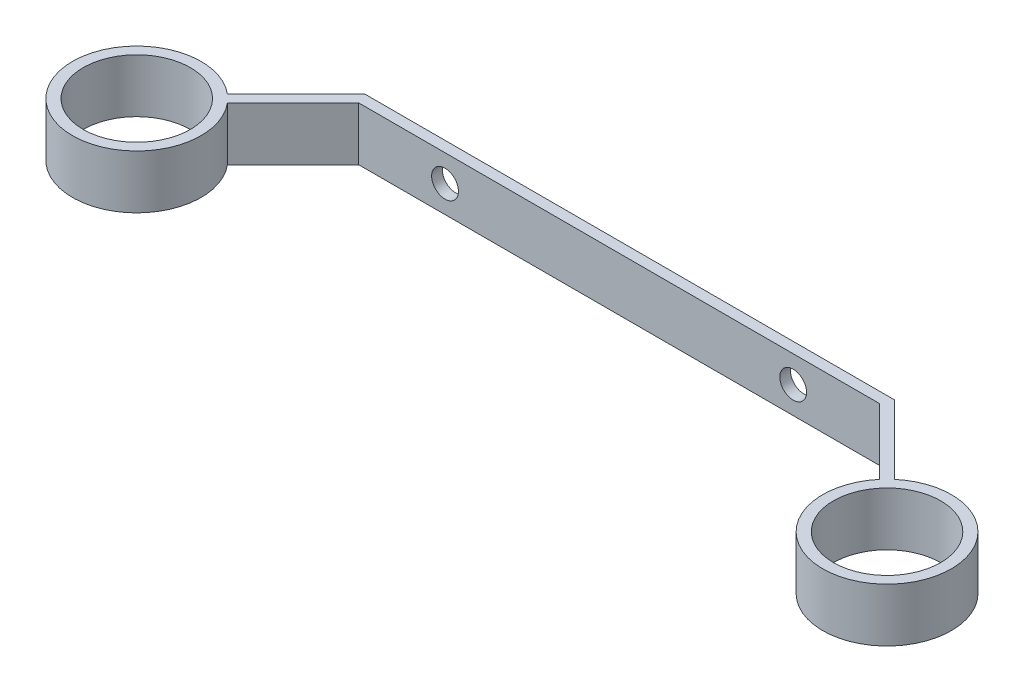
ISO-10303-21;
HEADER;
FILE_DESCRIPTION(('STEP AP214'),'2;1');
FILE_NAME('part.step','',(''),(''),'','','');
FILE_SCHEMA(('AUTOMOTIVE_DESIGN { 1 0 10303 214 1 1 1 1 }'));
ENDSEC;
DATA;
#1=APPLICATION_CONTEXT('core data for automotive mechanical design processes');
#2=APPLICATION_PROTOCOL_DEFINITION('international standard','automotive_design',2000,#1);
#3=PRODUCT_CONTEXT('',#1,'mechanical');
#4=PRODUCT('Part','Part','',(#3));
#5=PRODUCT_RELATED_PRODUCT_CATEGORY('part','',(#4));
#6=PRODUCT_DEFINITION_FORMATION('','',#4);
#7=PRODUCT_DEFINITION_CONTEXT('part definition',#1,'design');
#8=PRODUCT_DEFINITION('design','',#6,#7);
#9=PRODUCT_DEFINITION_SHAPE('','',#8);
#10=(LENGTH_UNIT() NAMED_UNIT(*) SI_UNIT(.MILLI.,.METRE.));
#11=(NAMED_UNIT(*) PLANE_ANGLE_UNIT() SI_UNIT($,.RADIAN.));
#12=(NAMED_UNIT(*) SI_UNIT($,.STERADIAN.) SOLID_ANGLE_UNIT());
#13=UNCERTAINTY_MEASURE_WITH_UNIT(LENGTH_MEASURE(1.E-05),#10,'distance_accuracy_value','');
#14=(GEOMETRIC_REPRESENTATION_CONTEXT(3) GLOBAL_UNCERTAINTY_ASSIGNED_CONTEXT((#13)) GLOBAL_UNIT_ASSIGNED_CONTEXT((#10,
#11,#12)) REPRESENTATION_CONTEXT('',''));
#15=CARTESIAN_POINT('',(0.,0.,0.));
#16=DIRECTION('',(0.,0.,1.));
#17=DIRECTION('',(1.,0.,0.));
#18=AXIS2_PLACEMENT_3D('',#15,#16,#17);
#19=CARTESIAN_POINT('',(0.,12.7,0.));
#20=DIRECTION('',(0.,1.,0.));
#21=DIRECTION('',(0.,0.,1.));
#22=AXIS2_PLACEMENT_3D('',#19,#20,#21);
#23=PLANE('',#22);
#24=CARTESIAN_POINT('',(0.,12.7,0.));
#25=DIRECTION('',(0.,1.,0.));
#26=DIRECTION('',(0.,0.,1.));
#27=AXIS2_PLACEMENT_3D('',#24,#25,#26);
#28=CIRCLE('',#27,12.7);
#29=CARTESIAN_POINT('',(0.,12.7,12.7));
#30=VERTEX_POINT('',#29);
#31=EDGE_CURVE('E136',#30,#30,#28,.T.);
#32=ORIENTED_EDGE('',*,*,#31,.F.);
#33=EDGE_LOOP('',(#32));
#34=FACE_BOUND('',#33,.T.);
#35=CARTESIAN_POINT('',(0.,12.7,0.));
#36=DIRECTION('',(0.,1.,0.));
#37=DIRECTION('',(0.,0.,1.));
#38=AXIS2_PLACEMENT_3D('',#35,#36,#37);
#39=CIRCLE('',#38,15.24);
#40=CARTESIAN_POINT('',(9.84079881145079,12.7,-11.6368500356647));
#41=VERTEX_POINT('',#40);
#42=CARTESIAN_POINT('',(11.6368500356646,12.7,-9.84079881145084));
#43=VERTEX_POINT('',#42);
#44=EDGE_CURVE('E147',#41,#43,#39,.T.);
#45=ORIENTED_EDGE('',*,*,#44,.T.);
#46=DIRECTION('',(0.707106781186546,0.,-0.707106781186549));
#47=VECTOR('',#46,1.);
#48=CARTESIAN_POINT('',(11.6368500356646,12.7,-9.84079881145084));
#49=LINE('',#48,#47);
#50=CARTESIAN_POINT('',(27.1960512242137,12.7,-25.4));
#51=VERTEX_POINT('',#50);
#52=EDGE_CURVE('E95',#43,#51,#49,.T.);
#53=ORIENTED_EDGE('',*,*,#52,.T.);
#54=DIRECTION('',(1.,0.,0.));
#55=VECTOR('',#54,1.);
#56=CARTESIAN_POINT('',(27.1960512242137,12.7,-25.4));
#57=LINE('',#56,#55);
#58=CARTESIAN_POINT('',(150.603948775786,12.7,-25.4));
#59=VERTEX_POINT('',#58);
#60=EDGE_CURVE('E184',#51,#59,#57,.T.);
#61=ORIENTED_EDGE('',*,*,#60,.T.);
#62=DIRECTION('',(0.707106781186547,0.,0.707106781186548));
#63=VECTOR('',#62,1.);
#64=CARTESIAN_POINT('',(150.603948775786,12.7,-25.4));
#65=LINE('',#64,#63);
#66=CARTESIAN_POINT('',(166.163149964335,12.7,-9.84079881145088));
#67=VERTEX_POINT('',#66);
#68=EDGE_CURVE('E186',#59,#67,#65,.T.);
#69=ORIENTED_EDGE('',*,*,#68,.T.);
#70=CARTESIAN_POINT('',(177.8,12.7,0.));
#71=DIRECTION('',(0.,1.,0.));
#72=DIRECTION('',(0.,0.,1.));
#73=AXIS2_PLACEMENT_3D('',#70,#71,#72);
#74=CIRCLE('',#73,15.24);
#75=CARTESIAN_POINT('',(167.959201188549,12.7,-11.6368500356647));
#76=VERTEX_POINT('',#75);
#77=EDGE_CURVE('E114',#67,#76,#74,.T.);
#78=ORIENTED_EDGE('',*,*,#77,.T.);
#79=DIRECTION('',(-0.707106781186546,0.,-0.707106781186549));
#80=VECTOR('',#79,1.);
#81=CARTESIAN_POINT('',(151.656051224214,12.7,-27.94));
#82=LINE('',#81,#80);
#83=CARTESIAN_POINT('',(151.656051224214,12.7,-27.94));
#84=VERTEX_POINT('',#83);
#85=EDGE_CURVE('E108',#76,#84,#82,.T.);
#86=ORIENTED_EDGE('',*,*,#85,.T.);
#87=DIRECTION('',(-1.,0.,0.));
#88=VECTOR('',#87,1.);
#89=CARTESIAN_POINT('',(26.1439487757861,12.7,-27.94));
#90=LINE('',#89,#88);
#91=CARTESIAN_POINT('',(26.1439487757861,12.7,-27.94));
#92=VERTEX_POINT('',#91);
#93=EDGE_CURVE('E112',#84,#92,#90,.T.);
#94=ORIENTED_EDGE('',*,*,#93,.T.);
#95=DIRECTION('',(-0.707106781186546,0.,0.707106781186549));
#96=VECTOR('',#95,1.);
#97=CARTESIAN_POINT('',(9.84079881145079,12.7,-11.6368500356647));
#98=LINE('',#97,#96);
#99=EDGE_CURVE('E52',#92,#41,#98,.T.);
#100=ORIENTED_EDGE('',*,*,#99,.T.);
#101=EDGE_LOOP('',(#45,#53,#61,#69,#78,#86,#94,#100));
#102=FACE_BOUND('',#101,.T.);
#103=CARTESIAN_POINT('',(177.8,12.7,0.));
#104=DIRECTION('',(0.,1.,0.));
#105=DIRECTION('',(0.,0.,1.));
#106=AXIS2_PLACEMENT_3D('',#103,#104,#105);
#107=CIRCLE('',#106,12.7);
#108=CARTESIAN_POINT('',(177.8,12.7,12.7));
#109=VERTEX_POINT('',#108);
#110=EDGE_CURVE('E165',#109,#109,#107,.T.);
#111=ORIENTED_EDGE('',*,*,#110,.F.);
#112=EDGE_LOOP('',(#111));
#113=FACE_BOUND('',#112,.T.);
#114=ADVANCED_FACE('F33',(#34,#102,#113),#23,.T.);
#115=CARTESIAN_POINT('',(0.,0.,0.));
#116=DIRECTION('',(0.,1.,0.));
#117=DIRECTION('',(0.,0.,1.));
#118=AXIS2_PLACEMENT_3D('',#115,#116,#117);
#119=PLANE('',#118);
#120=CARTESIAN_POINT('',(0.,0.,0.));
#121=DIRECTION('',(0.,1.,0.));
#122=DIRECTION('',(0.,0.,1.));
#123=AXIS2_PLACEMENT_3D('',#120,#121,#122);
#124=CIRCLE('',#123,12.7);
#125=CARTESIAN_POINT('',(0.,0.,12.7));
#126=VERTEX_POINT('',#125);
#127=EDGE_CURVE('E176',#126,#126,#124,.T.);
#128=ORIENTED_EDGE('',*,*,#127,.T.);
#129=EDGE_LOOP('',(#128));
#130=FACE_BOUND('',#129,.T.);
#131=CARTESIAN_POINT('',(0.,0.,0.));
#132=DIRECTION('',(0.,1.,0.));
#133=DIRECTION('',(0.,0.,1.));
#134=AXIS2_PLACEMENT_3D('',#131,#132,#133);
#135=CIRCLE('',#134,15.24);
#136=CARTESIAN_POINT('',(9.84079881145079,0.,-11.6368500356647));
#137=VERTEX_POINT('',#136);
#138=CARTESIAN_POINT('',(11.6368500356646,0.,-9.84079881145084));
#139=VERTEX_POINT('',#138);
#140=EDGE_CURVE('E132',#137,#139,#135,.T.);
#141=ORIENTED_EDGE('',*,*,#140,.F.);
#142=DIRECTION('',(-0.707106781186546,0.,0.707106781186549));
#143=VECTOR('',#142,1.);
#144=CARTESIAN_POINT('',(9.84079881145079,0.,-11.6368500356647));
#145=LINE('',#144,#143);
#146=CARTESIAN_POINT('',(26.1439487757861,0.,-27.94));
#147=VERTEX_POINT('',#146);
#148=EDGE_CURVE('E87',#147,#137,#145,.T.);
#149=ORIENTED_EDGE('',*,*,#148,.F.);
#150=DIRECTION('',(-1.,0.,0.));
#151=VECTOR('',#150,1.);
#152=CARTESIAN_POINT('',(26.1439487757861,0.,-27.94));
#153=LINE('',#152,#151);
#154=CARTESIAN_POINT('',(151.656051224214,0.,-27.94));
#155=VERTEX_POINT('',#154);
#156=EDGE_CURVE('E81',#155,#147,#153,.T.);
#157=ORIENTED_EDGE('',*,*,#156,.F.);
#158=DIRECTION('',(-0.707106781186546,0.,-0.707106781186549));
#159=VECTOR('',#158,1.);
#160=CARTESIAN_POINT('',(151.656051224214,0.,-27.94));
#161=LINE('',#160,#159);
#162=CARTESIAN_POINT('',(167.959201188549,0.,-11.6368500356647));
#163=VERTEX_POINT('',#162);
#164=EDGE_CURVE('E122',#163,#155,#161,.T.);
#165=ORIENTED_EDGE('',*,*,#164,.F.);
#166=CARTESIAN_POINT('',(177.8,0.,0.));
#167=DIRECTION('',(0.,1.,0.));
#168=DIRECTION('',(0.,0.,1.));
#169=AXIS2_PLACEMENT_3D('',#166,#167,#168);
#170=CIRCLE('',#169,15.24);
#171=CARTESIAN_POINT('',(166.163149964335,0.,-9.84079881145088));
#172=VERTEX_POINT('',#171);
#173=EDGE_CURVE('E142',#172,#163,#170,.T.);
#174=ORIENTED_EDGE('',*,*,#173,.F.);
#175=DIRECTION('',(0.707106781186547,0.,0.707106781186548));
#176=VECTOR('',#175,1.);
#177=CARTESIAN_POINT('',(150.603948775786,0.,-25.4));
#178=LINE('',#177,#176);
#179=CARTESIAN_POINT('',(150.603948775786,0.,-25.4));
#180=VERTEX_POINT('',#179);
#181=EDGE_CURVE('E140',#180,#172,#178,.T.);
#182=ORIENTED_EDGE('',*,*,#181,.F.);
#183=DIRECTION('',(1.,0.,0.));
#184=VECTOR('',#183,1.);
#185=CARTESIAN_POINT('',(27.1960512242137,0.,-25.4));
#186=LINE('',#185,#184);
#187=CARTESIAN_POINT('',(27.1960512242137,0.,-25.4));
#188=VERTEX_POINT('',#187);
#189=EDGE_CURVE('E138',#188,#180,#186,.T.);
#190=ORIENTED_EDGE('',*,*,#189,.F.);
#191=DIRECTION('',(0.707106781186546,0.,-0.707106781186549));
#192=VECTOR('',#191,1.);
#193=CARTESIAN_POINT('',(11.6368500356646,0.,-9.84079881145084));
#194=LINE('',#193,#192);
#195=EDGE_CURVE('E135',#139,#188,#194,.T.);
#196=ORIENTED_EDGE('',*,*,#195,.F.);
#197=EDGE_LOOP('',(#141,#149,#157,#165,#174,#182,#190,#196));
#198=FACE_BOUND('',#197,.T.);
#199=CARTESIAN_POINT('',(177.8,0.,0.));
#200=DIRECTION('',(0.,1.,0.));
#201=DIRECTION('',(0.,0.,1.));
#202=AXIS2_PLACEMENT_3D('',#199,#200,#201);
#203=CIRCLE('',#202,12.7);
#204=CARTESIAN_POINT('',(177.8,0.,12.7));
#205=VERTEX_POINT('',#204);
#206=EDGE_CURVE('E160',#205,#205,#203,.T.);
#207=ORIENTED_EDGE('',*,*,#206,.T.);
#208=EDGE_LOOP('',(#207));
#209=FACE_BOUND('',#208,.T.);
#210=ADVANCED_FACE('F199',(#130,#198,#209),#119,.F.);
#211=CARTESIAN_POINT('',(0.,12.7,0.));
#212=DIRECTION('',(0.,-1.,0.));
#213=DIRECTION('',(0.,0.,-1.));
#214=AXIS2_PLACEMENT_3D('',#211,#212,#213);
#215=CYLINDRICAL_SURFACE('',#214,15.24);
#216=ORIENTED_EDGE('',*,*,#140,.T.);
#217=DIRECTION('',(0.,-1.,0.));
#218=VECTOR('',#217,1.);
#219=CARTESIAN_POINT('',(11.6368500356646,12.7,-9.84079881145084));
#220=LINE('',#219,#218);
#221=EDGE_CURVE('E11',#43,#139,#220,.T.);
#222=ORIENTED_EDGE('',*,*,#221,.F.);
#223=ORIENTED_EDGE('',*,*,#44,.F.);
#224=DIRECTION('',(0.,-1.,0.));
#225=VECTOR('',#224,1.);
#226=CARTESIAN_POINT('',(9.84079881145079,12.7,-11.6368500356647));
#227=LINE('',#226,#225);
#228=EDGE_CURVE('E128',#41,#137,#227,.T.);
#229=ORIENTED_EDGE('',*,*,#228,.T.);
#230=EDGE_LOOP('',(#216,#222,#223,#229));
#231=FACE_BOUND('',#230,.T.);
#232=ADVANCED_FACE('F35',(#231),#215,.T.);
#233=CARTESIAN_POINT('',(11.6368500356646,12.7,-9.84079881145084));
#234=DIRECTION('',(-0.707106781186549,0.,-0.707106781186546));
#235=DIRECTION('',(-0.707106781186546,0.,0.707106781186549));
#236=AXIS2_PLACEMENT_3D('',#233,#234,#235);
#237=PLANE('',#236);
#238=ORIENTED_EDGE('',*,*,#195,.T.);
#239=DIRECTION('',(0.,-1.,0.));
#240=VECTOR('',#239,1.);
#241=CARTESIAN_POINT('',(27.1960512242137,12.7,-25.4));
#242=LINE('',#241,#240);
#243=EDGE_CURVE('E43',#51,#188,#242,.T.);
#244=ORIENTED_EDGE('',*,*,#243,.F.);
#245=ORIENTED_EDGE('',*,*,#52,.F.);
#246=ORIENTED_EDGE('',*,*,#221,.T.);
#247=EDGE_LOOP('',(#238,#244,#245,#246));
#248=FACE_BOUND('',#247,.T.);
#249=ADVANCED_FACE('F247',(#248),#237,.F.);
#250=CARTESIAN_POINT('',(27.1960512242137,12.7,-25.4));
#251=DIRECTION('',(0.,0.,-1.));
#252=DIRECTION('',(-1.,0.,0.));
#253=AXIS2_PLACEMENT_3D('',#250,#251,#252);
#254=PLANE('',#253);
#255=CARTESIAN_POINT('',(130.15000005,6.35,-25.4));
#256=DIRECTION('',(0.,0.,1.));
#257=DIRECTION('',(1.,0.,0.));
#258=AXIS2_PLACEMENT_3D('',#255,#256,#257);
#259=CIRCLE('',#258,3.175);
#260=CARTESIAN_POINT('',(133.32500005,6.35,-25.4));
#261=VERTEX_POINT('',#260);
#262=EDGE_CURVE('E172',#261,#261,#259,.T.);
#263=ORIENTED_EDGE('',*,*,#262,.F.);
#264=EDGE_LOOP('',(#263));
#265=FACE_BOUND('',#264,.T.);
#266=CARTESIAN_POINT('',(47.64999995,6.35,-25.4));
#267=DIRECTION('',(0.,0.,1.));
#268=DIRECTION('',(1.,0.,0.));
#269=AXIS2_PLACEMENT_3D('',#266,#267,#268);
#270=CIRCLE('',#269,3.175);
#271=CARTESIAN_POINT('',(50.82499995,6.35,-25.4));
#272=VERTEX_POINT('',#271);
#273=EDGE_CURVE('E161',#272,#272,#270,.T.);
#274=ORIENTED_EDGE('',*,*,#273,.F.);
#275=EDGE_LOOP('',(#274));
#276=FACE_BOUND('',#275,.T.);
#277=ORIENTED_EDGE('',*,*,#189,.T.);
#278=DIRECTION('',(0.,-1.,0.));
#279=VECTOR('',#278,1.);
#280=CARTESIAN_POINT('',(150.603948775786,12.7,-25.4));
#281=LINE('',#280,#279);
#282=EDGE_CURVE('E154',#59,#180,#281,.T.);
#283=ORIENTED_EDGE('',*,*,#282,.F.);
#284=ORIENTED_EDGE('',*,*,#60,.F.);
#285=ORIENTED_EDGE('',*,*,#243,.T.);
#286=EDGE_LOOP('',(#277,#283,#284,#285));
#287=FACE_BOUND('',#286,.T.);
#288=ADVANCED_FACE('F244',(#265,#276,#287),#254,.F.);
#289=CARTESIAN_POINT('',(150.603948775786,12.7,-25.4));
#290=DIRECTION('',(0.707106781186548,0.,-0.707106781186547));
#291=DIRECTION('',(-0.707106781186547,0.,-0.707106781186548));
#292=AXIS2_PLACEMENT_3D('',#289,#290,#291);
#293=PLANE('',#292);
#294=ORIENTED_EDGE('',*,*,#181,.T.);
#295=DIRECTION('',(0.,-1.,0.));
#296=VECTOR('',#295,1.);
#297=CARTESIAN_POINT('',(166.163149964335,12.7,-9.84079881145088));
#298=LINE('',#297,#296);
#299=EDGE_CURVE('E151',#67,#172,#298,.T.);
#300=ORIENTED_EDGE('',*,*,#299,.F.);
#301=ORIENTED_EDGE('',*,*,#68,.F.);
#302=ORIENTED_EDGE('',*,*,#282,.T.);
#303=EDGE_LOOP('',(#294,#300,#301,#302));
#304=FACE_BOUND('',#303,.T.);
#305=ADVANCED_FACE('F192',(#304),#293,.F.);
#306=CARTESIAN_POINT('',(177.8,12.7,0.));
#307=DIRECTION('',(0.,-1.,0.));
#308=DIRECTION('',(0.,0.,-1.));
#309=AXIS2_PLACEMENT_3D('',#306,#307,#308);
#310=CYLINDRICAL_SURFACE('',#309,15.24);
#311=ORIENTED_EDGE('',*,*,#173,.T.);
#312=DIRECTION('',(0.,-1.,0.));
#313=VECTOR('',#312,1.);
#314=CARTESIAN_POINT('',(167.959201188549,12.7,-11.6368500356647));
#315=LINE('',#314,#313);
#316=EDGE_CURVE('E123',#76,#163,#315,.T.);
#317=ORIENTED_EDGE('',*,*,#316,.F.);
#318=ORIENTED_EDGE('',*,*,#77,.F.);
#319=ORIENTED_EDGE('',*,*,#299,.T.);
#320=EDGE_LOOP('',(#311,#317,#318,#319));
#321=FACE_BOUND('',#320,.T.);
#322=ADVANCED_FACE('F196',(#321),#310,.T.);
#323=CARTESIAN_POINT('',(151.656051224214,12.7,-27.94));
#324=DIRECTION('',(-0.707106781186549,0.,0.707106781186546));
#325=DIRECTION('',(0.707106781186546,0.,0.707106781186549));
#326=AXIS2_PLACEMENT_3D('',#323,#324,#325);
#327=PLANE('',#326);
#328=ORIENTED_EDGE('',*,*,#164,.T.);
#329=DIRECTION('',(0.,-1.,0.));
#330=VECTOR('',#329,1.);
#331=CARTESIAN_POINT('',(151.656051224214,12.7,-27.94));
#332=LINE('',#331,#330);
#333=EDGE_CURVE('E119',#84,#155,#332,.T.);
#334=ORIENTED_EDGE('',*,*,#333,.F.);
#335=ORIENTED_EDGE('',*,*,#85,.F.);
#336=ORIENTED_EDGE('',*,*,#316,.T.);
#337=EDGE_LOOP('',(#328,#334,#335,#336));
#338=FACE_BOUND('',#337,.T.);
#339=ADVANCED_FACE('F120',(#338),#327,.F.);
#340=CARTESIAN_POINT('',(26.1439487757861,12.7,-27.94));
#341=DIRECTION('',(0.,0.,1.));
#342=DIRECTION('',(1.,0.,0.));
#343=AXIS2_PLACEMENT_3D('',#340,#341,#342);
#344=PLANE('',#343);
#345=CARTESIAN_POINT('',(130.15000005,6.35,-27.94));
#346=DIRECTION('',(0.,0.,1.));
#347=DIRECTION('',(1.,0.,0.));
#348=AXIS2_PLACEMENT_3D('',#345,#346,#347);
#349=CIRCLE('',#348,3.175);
#350=CARTESIAN_POINT('',(133.32500005,6.35,-27.94));
#351=VERTEX_POINT('',#350);
#352=EDGE_CURVE('E37',#351,#351,#349,.T.);
#353=ORIENTED_EDGE('',*,*,#352,.T.);
#354=EDGE_LOOP('',(#353));
#355=FACE_BOUND('',#354,.T.);
#356=CARTESIAN_POINT('',(47.64999995,6.35,-27.94));
#357=DIRECTION('',(0.,0.,1.));
#358=DIRECTION('',(1.,0.,0.));
#359=AXIS2_PLACEMENT_3D('',#356,#357,#358);
#360=CIRCLE('',#359,3.175);
#361=CARTESIAN_POINT('',(50.82499995,6.35,-27.94));
#362=VERTEX_POINT('',#361);
#363=EDGE_CURVE('E158',#362,#362,#360,.T.);
#364=ORIENTED_EDGE('',*,*,#363,.T.);
#365=EDGE_LOOP('',(#364));
#366=FACE_BOUND('',#365,.T.);
#367=ORIENTED_EDGE('',*,*,#156,.T.);
#368=DIRECTION('',(0.,-1.,0.));
#369=VECTOR('',#368,1.);
#370=CARTESIAN_POINT('',(26.1439487757861,12.7,-27.94));
#371=LINE('',#370,#369);
#372=EDGE_CURVE('E124',#92,#147,#371,.T.);
#373=ORIENTED_EDGE('',*,*,#372,.F.);
#374=ORIENTED_EDGE('',*,*,#93,.F.);
#375=ORIENTED_EDGE('',*,*,#333,.T.);
#376=EDGE_LOOP('',(#367,#373,#374,#375));
#377=FACE_BOUND('',#376,.T.);
#378=ADVANCED_FACE('F126',(#355,#366,#377),#344,.F.);
#379=CARTESIAN_POINT('',(9.84079881145079,12.7,-11.6368500356647));
#380=DIRECTION('',(0.707106781186549,0.,0.707106781186546));
#381=DIRECTION('',(0.707106781186546,0.,-0.707106781186549));
#382=AXIS2_PLACEMENT_3D('',#379,#380,#381);
#383=PLANE('',#382);
#384=ORIENTED_EDGE('',*,*,#148,.T.);
#385=ORIENTED_EDGE('',*,*,#228,.F.);
#386=ORIENTED_EDGE('',*,*,#99,.F.);
#387=ORIENTED_EDGE('',*,*,#372,.T.);
#388=EDGE_LOOP('',(#384,#385,#386,#387));
#389=FACE_BOUND('',#388,.T.);
#390=ADVANCED_FACE('F205',(#389),#383,.F.);
#391=CARTESIAN_POINT('',(0.,12.7,0.));
#392=DIRECTION('',(0.,-1.,0.));
#393=DIRECTION('',(0.,0.,-1.));
#394=AXIS2_PLACEMENT_3D('',#391,#392,#393);
#395=CYLINDRICAL_SURFACE('',#394,12.7);
#396=ORIENTED_EDGE('',*,*,#31,.T.);
#397=EDGE_LOOP('',(#396));
#398=FACE_BOUND('',#397,.T.);
#399=ORIENTED_EDGE('',*,*,#127,.F.);
#400=EDGE_LOOP('',(#399));
#401=FACE_BOUND('',#400,.T.);
#402=ADVANCED_FACE('F207',(#398,#401),#395,.F.);
#403=CARTESIAN_POINT('',(177.8,12.7,0.));
#404=DIRECTION('',(0.,-1.,0.));
#405=DIRECTION('',(0.,0.,-1.));
#406=AXIS2_PLACEMENT_3D('',#403,#404,#405);
#407=CYLINDRICAL_SURFACE('',#406,12.7);
#408=ORIENTED_EDGE('',*,*,#110,.T.);
#409=EDGE_LOOP('',(#408));
#410=FACE_BOUND('',#409,.T.);
#411=ORIENTED_EDGE('',*,*,#206,.F.);
#412=EDGE_LOOP('',(#411));
#413=FACE_BOUND('',#412,.T.);
#414=ADVANCED_FACE('F213',(#410,#413),#407,.F.);
#415=CARTESIAN_POINT('',(47.64999995,6.35,-38.1));
#416=DIRECTION('',(0.,0.,1.));
#417=DIRECTION('',(1.,0.,0.));
#418=AXIS2_PLACEMENT_3D('',#415,#416,#417);
#419=CYLINDRICAL_SURFACE('',#418,3.175);
#420=ORIENTED_EDGE('',*,*,#273,.T.);
#421=EDGE_LOOP('',(#420));
#422=FACE_BOUND('',#421,.T.);
#423=ORIENTED_EDGE('',*,*,#363,.F.);
#424=EDGE_LOOP('',(#423));
#425=FACE_BOUND('',#424,.T.);
#426=ADVANCED_FACE('F230',(#422,#425),#419,.F.);
#427=CARTESIAN_POINT('',(130.15000005,6.35,-38.1));
#428=DIRECTION('',(0.,0.,1.));
#429=DIRECTION('',(1.,0.,0.));
#430=AXIS2_PLACEMENT_3D('',#427,#428,#429);
#431=CYLINDRICAL_SURFACE('',#430,3.175);
#432=ORIENTED_EDGE('',*,*,#262,.T.);
#433=EDGE_LOOP('',(#432));
#434=FACE_BOUND('',#433,.T.);
#435=ORIENTED_EDGE('',*,*,#352,.F.);
#436=EDGE_LOOP('',(#435));
#437=FACE_BOUND('',#436,.T.);
#438=ADVANCED_FACE('F234',(#434,#437),#431,.F.);
#439=CLOSED_SHELL('',(#114,#210,#232,#249,#288,#305,#322,#339,#378,#390,#402,#414,#426,#438));
#440=MANIFOLD_SOLID_BREP('B2',#439);
#441=ADVANCED_BREP_SHAPE_REPRESENTATION('',(#18,#440),#14);
#442=SHAPE_DEFINITION_REPRESENTATION(#9,#441);
ENDSEC;
END-ISO-10303-21;
